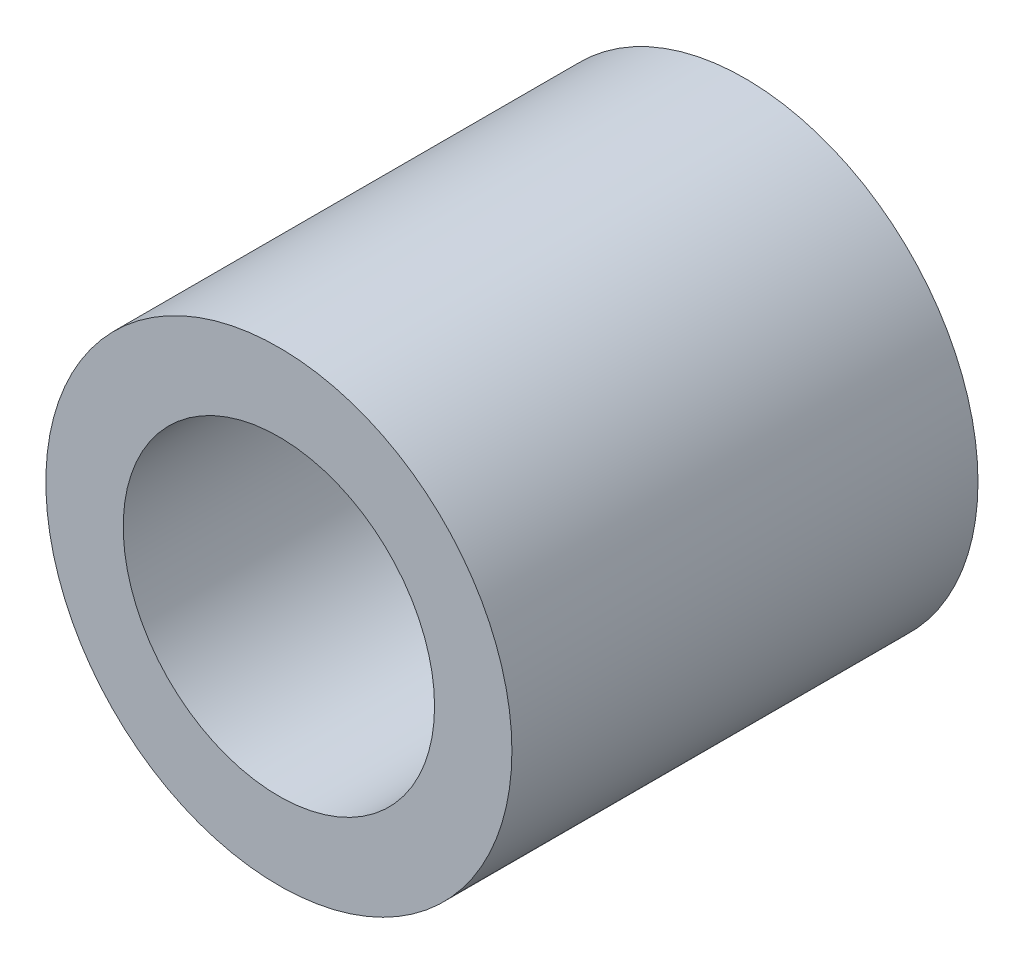
ISO-10303-21;
HEADER;
FILE_DESCRIPTION(('STEP AP214'),'2;1');
FILE_NAME('part.step','',(''),(''),'','','');
FILE_SCHEMA(('AUTOMOTIVE_DESIGN { 1 0 10303 214 1 1 1 1 }'));
ENDSEC;
DATA;
#1=APPLICATION_CONTEXT('core data for automotive mechanical design processes');
#2=APPLICATION_PROTOCOL_DEFINITION('international standard','automotive_design',2000,#1);
#3=PRODUCT_CONTEXT('',#1,'mechanical');
#4=PRODUCT('Part','Part','',(#3));
#5=PRODUCT_RELATED_PRODUCT_CATEGORY('part','',(#4));
#6=PRODUCT_DEFINITION_FORMATION('','',#4);
#7=PRODUCT_DEFINITION_CONTEXT('part definition',#1,'design');
#8=PRODUCT_DEFINITION('design','',#6,#7);
#9=PRODUCT_DEFINITION_SHAPE('','',#8);
#10=(LENGTH_UNIT() NAMED_UNIT(*) SI_UNIT(.MILLI.,.METRE.));
#11=(NAMED_UNIT(*) PLANE_ANGLE_UNIT() SI_UNIT($,.RADIAN.));
#12=(NAMED_UNIT(*) SI_UNIT($,.STERADIAN.) SOLID_ANGLE_UNIT());
#13=UNCERTAINTY_MEASURE_WITH_UNIT(LENGTH_MEASURE(1.E-05),#10,'distance_accuracy_value','');
#14=(GEOMETRIC_REPRESENTATION_CONTEXT(3) GLOBAL_UNCERTAINTY_ASSIGNED_CONTEXT((#13)) GLOBAL_UNIT_ASSIGNED_CONTEXT((#10,
#11,#12)) REPRESENTATION_CONTEXT('',''));
#15=CARTESIAN_POINT('',(0.,0.,0.));
#16=DIRECTION('',(0.,0.,1.));
#17=DIRECTION('',(1.,0.,0.));
#18=AXIS2_PLACEMENT_3D('',#15,#16,#17);
#19=CARTESIAN_POINT('',(0.,0.,2.5));
#20=DIRECTION('',(0.,0.,1.));
#21=DIRECTION('',(1.,0.,0.));
#22=AXIS2_PLACEMENT_3D('',#19,#20,#21);
#23=PLANE('',#22);
#24=CARTESIAN_POINT('',(0.,0.,2.5));
#25=DIRECTION('',(0.,0.,1.));
#26=DIRECTION('',(1.,0.,0.));
#27=AXIS2_PLACEMENT_3D('',#24,#25,#26);
#28=CIRCLE('',#27,1.25);
#29=CARTESIAN_POINT('',(1.25,0.,2.5));
#30=VERTEX_POINT('',#29);
#31=EDGE_CURVE('E10',#30,#30,#28,.T.);
#32=ORIENTED_EDGE('',*,*,#31,.T.);
#33=EDGE_LOOP('',(#32));
#34=FACE_BOUND('',#33,.T.);
#35=CARTESIAN_POINT('',(0.,0.,2.5));
#36=DIRECTION('',(0.,0.,1.));
#37=DIRECTION('',(1.,0.,0.));
#38=AXIS2_PLACEMENT_3D('',#35,#36,#37);
#39=CIRCLE('',#38,0.835);
#40=CARTESIAN_POINT('',(0.835,0.,2.5));
#41=VERTEX_POINT('',#40);
#42=EDGE_CURVE('E50',#41,#41,#39,.T.);
#43=ORIENTED_EDGE('',*,*,#42,.F.);
#44=EDGE_LOOP('',(#43));
#45=FACE_BOUND('',#44,.T.);
#46=ADVANCED_FACE('F37',(#34,#45),#23,.T.);
#47=CARTESIAN_POINT('',(0.,0.,0.));
#48=DIRECTION('',(0.,0.,1.));
#49=DIRECTION('',(1.,0.,0.));
#50=AXIS2_PLACEMENT_3D('',#47,#48,#49);
#51=PLANE('',#50);
#52=CARTESIAN_POINT('',(0.,0.,0.));
#53=DIRECTION('',(0.,0.,1.));
#54=DIRECTION('',(1.,0.,0.));
#55=AXIS2_PLACEMENT_3D('',#52,#53,#54);
#56=CIRCLE('',#55,1.25);
#57=CARTESIAN_POINT('',(1.25,0.,0.));
#58=VERTEX_POINT('',#57);
#59=EDGE_CURVE('E41',#58,#58,#56,.T.);
#60=ORIENTED_EDGE('',*,*,#59,.F.);
#61=EDGE_LOOP('',(#60));
#62=FACE_BOUND('',#61,.T.);
#63=CARTESIAN_POINT('',(0.,0.,0.));
#64=DIRECTION('',(0.,0.,1.));
#65=DIRECTION('',(1.,0.,0.));
#66=AXIS2_PLACEMENT_3D('',#63,#64,#65);
#67=CIRCLE('',#66,0.835);
#68=CARTESIAN_POINT('',(0.835,0.,0.));
#69=VERTEX_POINT('',#68);
#70=EDGE_CURVE('E52',#69,#69,#67,.T.);
#71=ORIENTED_EDGE('',*,*,#70,.T.);
#72=EDGE_LOOP('',(#71));
#73=FACE_BOUND('',#72,.T.);
#74=ADVANCED_FACE('F64',(#62,#73),#51,.F.);
#75=CARTESIAN_POINT('',(0.,0.,2.5));
#76=DIRECTION('',(0.,0.,-1.));
#77=DIRECTION('',(-1.,0.,0.));
#78=AXIS2_PLACEMENT_3D('',#75,#76,#77);
#79=CYLINDRICAL_SURFACE('',#78,1.25);
#80=ORIENTED_EDGE('',*,*,#31,.F.);
#81=EDGE_LOOP('',(#80));
#82=FACE_BOUND('',#81,.T.);
#83=ORIENTED_EDGE('',*,*,#59,.T.);
#84=EDGE_LOOP('',(#83));
#85=FACE_BOUND('',#84,.T.);
#86=ADVANCED_FACE('F39',(#82,#85),#79,.T.);
#87=CARTESIAN_POINT('',(0.,0.,2.5));
#88=DIRECTION('',(0.,0.,-1.));
#89=DIRECTION('',(-1.,0.,0.));
#90=AXIS2_PLACEMENT_3D('',#87,#88,#89);
#91=CYLINDRICAL_SURFACE('',#90,0.835);
#92=ORIENTED_EDGE('',*,*,#42,.T.);
#93=EDGE_LOOP('',(#92));
#94=FACE_BOUND('',#93,.T.);
#95=ORIENTED_EDGE('',*,*,#70,.F.);
#96=EDGE_LOOP('',(#95));
#97=FACE_BOUND('',#96,.T.);
#98=ADVANCED_FACE('F60',(#94,#97),#91,.F.);
#99=CLOSED_SHELL('',(#46,#74,#86,#98));
#100=MANIFOLD_SOLID_BREP('B2',#99);
#101=ADVANCED_BREP_SHAPE_REPRESENTATION('',(#18,#100),#14);
#102=SHAPE_DEFINITION_REPRESENTATION(#9,#101);
ENDSEC;
END-ISO-10303-21;
